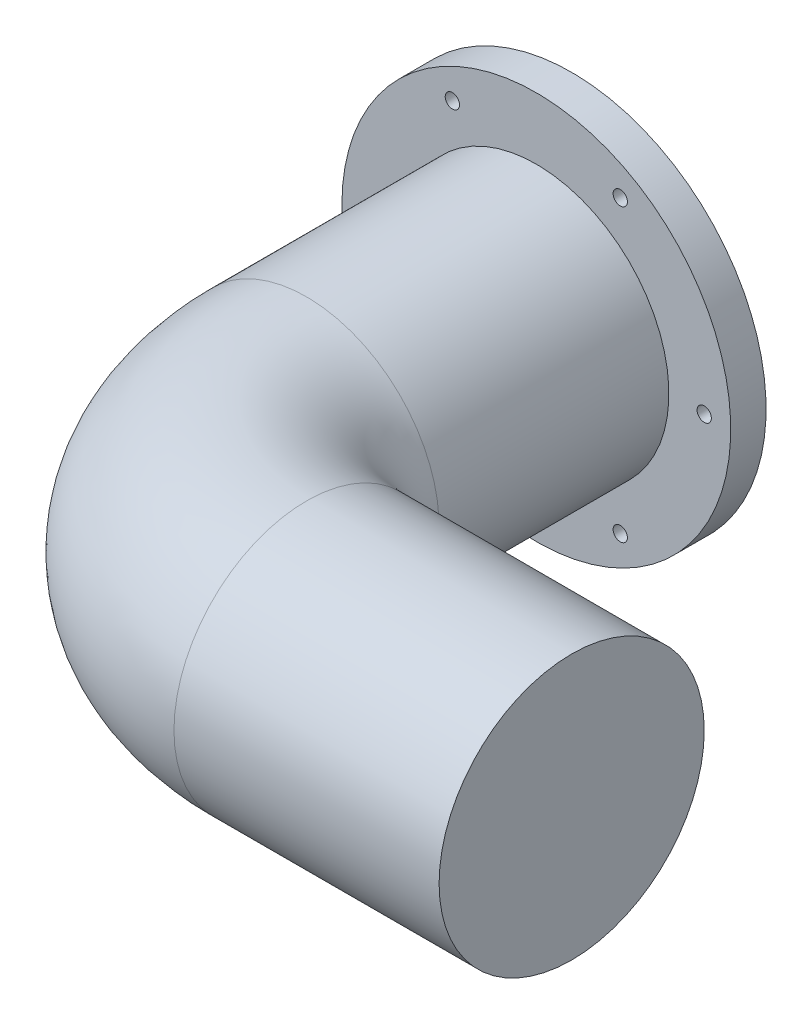
ISO-10303-21;
HEADER;
FILE_DESCRIPTION(('STEP AP214'),'2;1');
FILE_NAME('part.step','',(''),(''),'','','');
FILE_SCHEMA(('AUTOMOTIVE_DESIGN { 1 0 10303 214 1 1 1 1 }'));
ENDSEC;
DATA;
#1=APPLICATION_CONTEXT('core data for automotive mechanical design processes');
#2=APPLICATION_PROTOCOL_DEFINITION('international standard','automotive_design',2000,#1);
#3=PRODUCT_CONTEXT('',#1,'mechanical');
#4=PRODUCT('Part','Part','',(#3));
#5=PRODUCT_RELATED_PRODUCT_CATEGORY('part','',(#4));
#6=PRODUCT_DEFINITION_FORMATION('','',#4);
#7=PRODUCT_DEFINITION_CONTEXT('part definition',#1,'design');
#8=PRODUCT_DEFINITION('design','',#6,#7);
#9=PRODUCT_DEFINITION_SHAPE('','',#8);
#10=(LENGTH_UNIT() NAMED_UNIT(*) SI_UNIT(.MILLI.,.METRE.));
#11=(NAMED_UNIT(*) PLANE_ANGLE_UNIT() SI_UNIT($,.RADIAN.));
#12=(NAMED_UNIT(*) SI_UNIT($,.STERADIAN.) SOLID_ANGLE_UNIT());
#13=UNCERTAINTY_MEASURE_WITH_UNIT(LENGTH_MEASURE(1.E-05),#10,'distance_accuracy_value','');
#14=(GEOMETRIC_REPRESENTATION_CONTEXT(3) GLOBAL_UNCERTAINTY_ASSIGNED_CONTEXT((#13)) GLOBAL_UNIT_ASSIGNED_CONTEXT((#10,
#11,#12)) REPRESENTATION_CONTEXT('',''));
#15=CARTESIAN_POINT('',(0.,0.,0.));
#16=DIRECTION('',(0.,0.,1.));
#17=DIRECTION('',(1.,0.,0.));
#18=AXIS2_PLACEMENT_3D('',#15,#16,#17);
#19=CARTESIAN_POINT('',(-125.,0.,-115.));
#20=DIRECTION('',(0.,0.,-1.));
#21=DIRECTION('',(-1.,0.,0.));
#22=AXIS2_PLACEMENT_3D('',#19,#20,#21);
#23=PLANE('',#22);
#24=CARTESIAN_POINT('',(-148.75,-41.1362066797608,-115.));
#25=DIRECTION('',(0.,0.,1.));
#26=DIRECTION('',(1.,0.,0.));
#27=AXIS2_PLACEMENT_3D('',#24,#25,#26);
#28=CIRCLE('',#27,2.0193);
#29=CARTESIAN_POINT('',(-146.7307,-41.1362066797608,-115.));
#30=VERTEX_POINT('',#29);
#31=EDGE_CURVE('E115',#30,#30,#28,.T.);
#32=ORIENTED_EDGE('',*,*,#31,.F.);
#33=EDGE_LOOP('',(#32));
#34=FACE_BOUND('',#33,.T.);
#35=CARTESIAN_POINT('',(-101.25,-41.1362066797608,-115.));
#36=DIRECTION('',(0.,0.,1.));
#37=DIRECTION('',(1.,0.,0.));
#38=AXIS2_PLACEMENT_3D('',#35,#36,#37);
#39=CIRCLE('',#38,2.0193);
#40=CARTESIAN_POINT('',(-99.2307,-41.1362066797608,-115.));
#41=VERTEX_POINT('',#40);
#42=EDGE_CURVE('E107',#41,#41,#39,.T.);
#43=ORIENTED_EDGE('',*,*,#42,.F.);
#44=EDGE_LOOP('',(#43));
#45=FACE_BOUND('',#44,.T.);
#46=CARTESIAN_POINT('',(-101.25,41.1362066797608,-115.));
#47=DIRECTION('',(0.,0.,1.));
#48=DIRECTION('',(1.,0.,0.));
#49=AXIS2_PLACEMENT_3D('',#46,#47,#48);
#50=CIRCLE('',#49,2.0193);
#51=CARTESIAN_POINT('',(-99.2307,41.1362066797608,-115.));
#52=VERTEX_POINT('',#51);
#53=EDGE_CURVE('E91',#52,#52,#50,.T.);
#54=ORIENTED_EDGE('',*,*,#53,.F.);
#55=EDGE_LOOP('',(#54));
#56=FACE_BOUND('',#55,.T.);
#57=CARTESIAN_POINT('',(-125.,0.,-115.));
#58=DIRECTION('',(0.,0.,-1.));
#59=DIRECTION('',(-1.,0.,0.));
#60=AXIS2_PLACEMENT_3D('',#57,#58,#59);
#61=CIRCLE('',#60,37.5);
#62=CARTESIAN_POINT('',(-162.5,0.,-115.));
#63=VERTEX_POINT('',#62);
#64=EDGE_CURVE('E11',#63,#63,#61,.T.);
#65=ORIENTED_EDGE('',*,*,#64,.T.);
#66=EDGE_LOOP('',(#65));
#67=FACE_BOUND('',#66,.T.);
#68=CARTESIAN_POINT('',(-125.,0.,-115.));
#69=DIRECTION('',(0.,0.,-1.));
#70=DIRECTION('',(-1.,0.,0.));
#71=AXIS2_PLACEMENT_3D('',#68,#69,#70);
#72=CIRCLE('',#71,55.);
#73=CARTESIAN_POINT('',(-180.,0.,-115.));
#74=VERTEX_POINT('',#73);
#75=EDGE_CURVE('E79',#74,#74,#72,.T.);
#76=ORIENTED_EDGE('',*,*,#75,.F.);
#77=EDGE_LOOP('',(#76));
#78=FACE_BOUND('',#77,.T.);
#79=CARTESIAN_POINT('',(-77.5,0.,-115.));
#80=DIRECTION('',(0.,0.,1.));
#81=DIRECTION('',(1.,0.,0.));
#82=AXIS2_PLACEMENT_3D('',#79,#80,#81);
#83=CIRCLE('',#82,2.0193);
#84=CARTESIAN_POINT('',(-75.4807,0.,-115.));
#85=VERTEX_POINT('',#84);
#86=EDGE_CURVE('E99',#85,#85,#83,.T.);
#87=ORIENTED_EDGE('',*,*,#86,.F.);
#88=EDGE_LOOP('',(#87));
#89=FACE_BOUND('',#88,.T.);
#90=CARTESIAN_POINT('',(-172.5,0.,-115.));
#91=DIRECTION('',(0.,0.,1.));
#92=DIRECTION('',(1.,0.,0.));
#93=AXIS2_PLACEMENT_3D('',#90,#91,#92);
#94=CIRCLE('',#93,2.0193);
#95=CARTESIAN_POINT('',(-170.4807,0.,-115.));
#96=VERTEX_POINT('',#95);
#97=EDGE_CURVE('E123',#96,#96,#94,.T.);
#98=ORIENTED_EDGE('',*,*,#97,.F.);
#99=EDGE_LOOP('',(#98));
#100=FACE_BOUND('',#99,.T.);
#101=CARTESIAN_POINT('',(-148.75,41.1362066797608,-115.));
#102=DIRECTION('',(0.,0.,1.));
#103=DIRECTION('',(1.,0.,0.));
#104=AXIS2_PLACEMENT_3D('',#101,#102,#103);
#105=CIRCLE('',#104,2.0193);
#106=CARTESIAN_POINT('',(-146.7307,41.1362066797608,-115.));
#107=VERTEX_POINT('',#106);
#108=EDGE_CURVE('E131',#107,#107,#105,.T.);
#109=ORIENTED_EDGE('',*,*,#108,.F.);
#110=EDGE_LOOP('',(#109));
#111=FACE_BOUND('',#110,.T.);
#112=ADVANCED_FACE('F55',(#34,#45,#56,#67,#78,#89,#100,#111),#23,.F.);
#113=CARTESIAN_POINT('',(-125.,0.,-50.));
#114=DIRECTION('',(0.,0.,-1.));
#115=DIRECTION('',(-1.,0.,0.));
#116=AXIS2_PLACEMENT_3D('',#113,#114,#115);
#117=CYLINDRICAL_SURFACE('',#116,37.5);
#118=CARTESIAN_POINT('',(-125.,0.,-50.));
#119=DIRECTION('',(0.,0.,1.));
#120=DIRECTION('',(1.,0.,0.));
#121=AXIS2_PLACEMENT_3D('',#118,#119,#120);
#122=CIRCLE('',#121,37.5);
#123=CARTESIAN_POINT('',(-162.5,0.,-50.));
#124=VERTEX_POINT('',#123);
#125=EDGE_CURVE('E63',#124,#124,#122,.T.);
#126=ORIENTED_EDGE('',*,*,#125,.F.);
#127=EDGE_LOOP('',(#126));
#128=FACE_BOUND('',#127,.T.);
#129=ORIENTED_EDGE('',*,*,#64,.F.);
#130=EDGE_LOOP('',(#129));
#131=FACE_BOUND('',#130,.T.);
#132=ADVANCED_FACE('F217',(#128,#131),#117,.T.);
#133=CARTESIAN_POINT('',(0.,0.,0.));
#134=DIRECTION('',(1.,0.,0.));
#135=DIRECTION('',(0.,0.,-1.));
#136=AXIS2_PLACEMENT_3D('',#133,#134,#135);
#137=PLANE('',#136);
#138=CARTESIAN_POINT('',(0.,0.,0.));
#139=DIRECTION('',(1.,0.,0.));
#140=DIRECTION('',(0.,0.,-1.));
#141=AXIS2_PLACEMENT_3D('',#138,#139,#140);
#142=CIRCLE('',#141,37.5);
#143=CARTESIAN_POINT('',(0.,0.,-37.5));
#144=VERTEX_POINT('',#143);
#145=EDGE_CURVE('E73',#144,#144,#142,.T.);
#146=ORIENTED_EDGE('',*,*,#145,.T.);
#147=EDGE_LOOP('',(#146));
#148=FACE_BOUND('',#147,.T.);
#149=ADVANCED_FACE('F57',(#148),#137,.T.);
#150=CARTESIAN_POINT('',(0.,0.,0.));
#151=DIRECTION('',(-1.,0.,0.));
#152=DIRECTION('',(0.,0.,1.));
#153=AXIS2_PLACEMENT_3D('',#150,#151,#152);
#154=CYLINDRICAL_SURFACE('',#153,37.5);
#155=CARTESIAN_POINT('',(-75.,0.,0.));
#156=DIRECTION('',(1.,0.,0.));
#157=DIRECTION('',(0.,0.,-1.));
#158=AXIS2_PLACEMENT_3D('',#155,#156,#157);
#159=CIRCLE('',#158,37.5);
#160=CARTESIAN_POINT('',(-75.,0.,37.5));
#161=VERTEX_POINT('',#160);
#162=EDGE_CURVE('E68',#161,#161,#159,.T.);
#163=ORIENTED_EDGE('',*,*,#162,.T.);
#164=EDGE_LOOP('',(#163));
#165=FACE_BOUND('',#164,.T.);
#166=ORIENTED_EDGE('',*,*,#145,.F.);
#167=EDGE_LOOP('',(#166));
#168=FACE_BOUND('',#167,.T.);
#169=ADVANCED_FACE('F215',(#165,#168),#154,.T.);
#170=CARTESIAN_POINT('',(-75.,0.,-50.));
#171=DIRECTION('',(0.,-1.,0.));
#172=DIRECTION('',(0.,0.,-1.));
#173=AXIS2_PLACEMENT_3D('',#170,#171,#172);
#174=TOROIDAL_SURFACE('',#173,50.,37.5);
#175=CARTESIAN_POINT('',(-75.,0.,-50.));
#176=DIRECTION('',(0.,-1.,0.));
#177=DIRECTION('',(0.,0.,-1.));
#178=AXIS2_PLACEMENT_3D('',#175,#176,#177);
#179=CIRCLE('',#178,87.5);
#180=EDGE_CURVE('',#161,#124,#179,.T.);
#181=ORIENTED_EDGE('',*,*,#162,.F.);
#182=ORIENTED_EDGE('',*,*,#125,.T.);
#183=ORIENTED_EDGE('',*,*,#180,.T.);
#184=ORIENTED_EDGE('',*,*,#180,.F.);
#185=EDGE_LOOP('',(#181,#183,#182,#184));
#186=FACE_BOUND('',#185,.T.);
#187=ADVANCED_FACE('F209',(#186),#174,.T.);
#188=CARTESIAN_POINT('',(-125.,0.,-115.));
#189=DIRECTION('',(0.,0.,-1.));
#190=DIRECTION('',(-1.,0.,0.));
#191=AXIS2_PLACEMENT_3D('',#188,#189,#190);
#192=CYLINDRICAL_SURFACE('',#191,55.);
#193=ORIENTED_EDGE('',*,*,#75,.T.);
#194=EDGE_LOOP('',(#193));
#195=FACE_BOUND('',#194,.T.);
#196=CARTESIAN_POINT('',(-125.,0.,-125.));
#197=DIRECTION('',(0.,0.,-1.));
#198=DIRECTION('',(-1.,0.,0.));
#199=AXIS2_PLACEMENT_3D('',#196,#197,#198);
#200=CIRCLE('',#199,55.);
#201=CARTESIAN_POINT('',(-180.,0.,-125.));
#202=VERTEX_POINT('',#201);
#203=EDGE_CURVE('E80',#202,#202,#200,.T.);
#204=ORIENTED_EDGE('',*,*,#203,.F.);
#205=EDGE_LOOP('',(#204));
#206=FACE_BOUND('',#205,.T.);
#207=ADVANCED_FACE('F190',(#195,#206),#192,.T.);
#208=CARTESIAN_POINT('',(-125.,0.,-125.));
#209=DIRECTION('',(0.,0.,1.));
#210=DIRECTION('',(1.,0.,0.));
#211=AXIS2_PLACEMENT_3D('',#208,#209,#210);
#212=PLANE('',#211);
#213=CARTESIAN_POINT('',(-148.055532132327,-14.9897444306183,-125.));
#214=DIRECTION('',(0.,0.,-1.));
#215=DIRECTION('',(-1.,0.,0.));
#216=AXIS2_PLACEMENT_3D('',#213,#214,#215);
#217=CIRCLE('',#216,7.00000000000001);
#218=CARTESIAN_POINT('',(-155.055532132327,-14.9897444306183,-125.));
#219=VERTEX_POINT('',#218);
#220=EDGE_CURVE('E148',#219,#219,#217,.T.);
#221=ORIENTED_EDGE('',*,*,#220,.F.);
#222=EDGE_LOOP('',(#221));
#223=FACE_BOUND('',#222,.T.);
#224=CARTESIAN_POINT('',(-124.556438482612,-27.4964225524029,-125.));
#225=DIRECTION('',(0.,0.,-1.));
#226=DIRECTION('',(-1.,0.,0.));
#227=AXIS2_PLACEMENT_3D('',#224,#225,#226);
#228=CIRCLE('',#227,7.00000000000003);
#229=CARTESIAN_POINT('',(-131.556438482612,-27.4964225524029,-125.));
#230=VERTEX_POINT('',#229);
#231=EDGE_CURVE('E156',#230,#230,#228,.T.);
#232=ORIENTED_EDGE('',*,*,#231,.F.);
#233=EDGE_LOOP('',(#232));
#234=FACE_BOUND('',#233,.T.);
#235=CARTESIAN_POINT('',(-101.472972620166,-14.2382928284447,-125.));
#236=DIRECTION('',(0.,0.,-1.));
#237=DIRECTION('',(-1.,0.,0.));
#238=AXIS2_PLACEMENT_3D('',#235,#236,#237);
#239=CIRCLE('',#238,7.);
#240=CARTESIAN_POINT('',(-108.472972620166,-14.2382928284447,-125.));
#241=VERTEX_POINT('',#240);
#242=EDGE_CURVE('E164',#241,#241,#239,.T.);
#243=ORIENTED_EDGE('',*,*,#242,.F.);
#244=EDGE_LOOP('',(#243));
#245=FACE_BOUND('',#244,.T.);
#246=CARTESIAN_POINT('',(-100.434896061282,12.3614589947941,-125.));
#247=DIRECTION('',(0.,0.,-1.));
#248=DIRECTION('',(-1.,0.,0.));
#249=AXIS2_PLACEMENT_3D('',#246,#247,#248);
#250=CIRCLE('',#249,7.);
#251=CARTESIAN_POINT('',(-107.434896061282,12.3614589947941,-125.));
#252=VERTEX_POINT('',#251);
#253=EDGE_CURVE('E172',#252,#252,#250,.T.);
#254=ORIENTED_EDGE('',*,*,#253,.F.);
#255=EDGE_LOOP('',(#254));
#256=FACE_BOUND('',#255,.T.);
#257=CARTESIAN_POINT('',(-122.414911455471,27.3782270648949,-125.));
#258=DIRECTION('',(0.,0.,-1.));
#259=DIRECTION('',(-1.,0.,0.));
#260=AXIS2_PLACEMENT_3D('',#257,#258,#259);
#261=CIRCLE('',#260,7.00000000000004);
#262=CARTESIAN_POINT('',(-129.414911455471,27.3782270648949,-125.));
#263=VERTEX_POINT('',#262);
#264=EDGE_CURVE('E140',#263,#263,#261,.T.);
#265=ORIENTED_EDGE('',*,*,#264,.F.);
#266=EDGE_LOOP('',(#265));
#267=FACE_BOUND('',#266,.T.);
#268=CARTESIAN_POINT('',(-146.817216858009,16.7409392977397,-125.));
#269=DIRECTION('',(0.,0.,-1.));
#270=DIRECTION('',(-1.,0.,0.));
#271=AXIS2_PLACEMENT_3D('',#268,#269,#270);
#272=CIRCLE('',#271,7.00000000000001);
#273=CARTESIAN_POINT('',(-153.817216858009,16.7409392977397,-125.));
#274=VERTEX_POINT('',#273);
#275=EDGE_CURVE('E136',#274,#274,#272,.T.);
#276=ORIENTED_EDGE('',*,*,#275,.F.);
#277=EDGE_LOOP('',(#276));
#278=FACE_BOUND('',#277,.T.);
#279=CARTESIAN_POINT('',(-148.75,41.1362066797608,-125.));
#280=DIRECTION('',(0.,0.,1.));
#281=DIRECTION('',(1.,0.,0.));
#282=AXIS2_PLACEMENT_3D('',#279,#280,#281);
#283=CIRCLE('',#282,2.0193);
#284=CARTESIAN_POINT('',(-146.7307,41.1362066797608,-125.));
#285=VERTEX_POINT('',#284);
#286=EDGE_CURVE('E127',#285,#285,#283,.T.);
#287=ORIENTED_EDGE('',*,*,#286,.T.);
#288=EDGE_LOOP('',(#287));
#289=FACE_BOUND('',#288,.T.);
#290=CARTESIAN_POINT('',(-172.5,0.,-125.));
#291=DIRECTION('',(0.,0.,1.));
#292=DIRECTION('',(1.,0.,0.));
#293=AXIS2_PLACEMENT_3D('',#290,#291,#292);
#294=CIRCLE('',#293,2.0193);
#295=CARTESIAN_POINT('',(-170.4807,0.,-125.));
#296=VERTEX_POINT('',#295);
#297=EDGE_CURVE('E119',#296,#296,#294,.T.);
#298=ORIENTED_EDGE('',*,*,#297,.T.);
#299=EDGE_LOOP('',(#298));
#300=FACE_BOUND('',#299,.T.);
#301=CARTESIAN_POINT('',(-148.75,-41.1362066797608,-125.));
#302=DIRECTION('',(0.,0.,1.));
#303=DIRECTION('',(1.,0.,0.));
#304=AXIS2_PLACEMENT_3D('',#301,#302,#303);
#305=CIRCLE('',#304,2.0193);
#306=CARTESIAN_POINT('',(-146.7307,-41.1362066797608,-125.));
#307=VERTEX_POINT('',#306);
#308=EDGE_CURVE('E111',#307,#307,#305,.T.);
#309=ORIENTED_EDGE('',*,*,#308,.T.);
#310=EDGE_LOOP('',(#309));
#311=FACE_BOUND('',#310,.T.);
#312=CARTESIAN_POINT('',(-101.25,-41.1362066797608,-125.));
#313=DIRECTION('',(0.,0.,1.));
#314=DIRECTION('',(1.,0.,0.));
#315=AXIS2_PLACEMENT_3D('',#312,#313,#314);
#316=CIRCLE('',#315,2.0193);
#317=CARTESIAN_POINT('',(-99.2307,-41.1362066797608,-125.));
#318=VERTEX_POINT('',#317);
#319=EDGE_CURVE('E103',#318,#318,#316,.T.);
#320=ORIENTED_EDGE('',*,*,#319,.T.);
#321=EDGE_LOOP('',(#320));
#322=FACE_BOUND('',#321,.T.);
#323=CARTESIAN_POINT('',(-77.5,0.,-125.));
#324=DIRECTION('',(0.,0.,1.));
#325=DIRECTION('',(1.,0.,0.));
#326=AXIS2_PLACEMENT_3D('',#323,#324,#325);
#327=CIRCLE('',#326,2.0193);
#328=CARTESIAN_POINT('',(-75.4807,0.,-125.));
#329=VERTEX_POINT('',#328);
#330=EDGE_CURVE('E95',#329,#329,#327,.T.);
#331=ORIENTED_EDGE('',*,*,#330,.T.);
#332=EDGE_LOOP('',(#331));
#333=FACE_BOUND('',#332,.T.);
#334=CARTESIAN_POINT('',(-101.25,41.1362066797608,-125.));
#335=DIRECTION('',(0.,0.,1.));
#336=DIRECTION('',(1.,0.,0.));
#337=AXIS2_PLACEMENT_3D('',#334,#335,#336);
#338=CIRCLE('',#337,2.0193);
#339=CARTESIAN_POINT('',(-99.2307,41.1362066797608,-125.));
#340=VERTEX_POINT('',#339);
#341=EDGE_CURVE('E84',#340,#340,#338,.T.);
#342=ORIENTED_EDGE('',*,*,#341,.T.);
#343=EDGE_LOOP('',(#342));
#344=FACE_BOUND('',#343,.T.);
#345=ORIENTED_EDGE('',*,*,#203,.T.);
#346=EDGE_LOOP('',(#345));
#347=FACE_BOUND('',#346,.T.);
#348=ADVANCED_FACE('F186',(#223,#234,#245,#256,#267,#278,#289,#300,#311,#322,#333,#344,#347),
#212,.F.);
#349=CARTESIAN_POINT('',(-101.25,41.1362066797608,-115.));
#350=DIRECTION('',(0.,0.,1.));
#351=DIRECTION('',(1.,0.,0.));
#352=AXIS2_PLACEMENT_3D('',#349,#350,#351);
#353=CYLINDRICAL_SURFACE('',#352,2.0193);
#354=ORIENTED_EDGE('',*,*,#341,.F.);
#355=EDGE_LOOP('',(#354));
#356=FACE_BOUND('',#355,.T.);
#357=ORIENTED_EDGE('',*,*,#53,.T.);
#358=EDGE_LOOP('',(#357));
#359=FACE_BOUND('',#358,.T.);
#360=ADVANCED_FACE('F189',(#356,#359),#353,.F.);
#361=CARTESIAN_POINT('',(-77.5,0.,-115.));
#362=DIRECTION('',(0.,0.,1.));
#363=DIRECTION('',(1.,0.,0.));
#364=AXIS2_PLACEMENT_3D('',#361,#362,#363);
#365=CYLINDRICAL_SURFACE('',#364,2.0193);
#366=ORIENTED_EDGE('',*,*,#330,.F.);
#367=EDGE_LOOP('',(#366));
#368=FACE_BOUND('',#367,.T.);
#369=ORIENTED_EDGE('',*,*,#86,.T.);
#370=EDGE_LOOP('',(#369));
#371=FACE_BOUND('',#370,.T.);
#372=ADVANCED_FACE('F234',(#368,#371),#365,.F.);
#373=CARTESIAN_POINT('',(-101.25,-41.1362066797608,-115.));
#374=DIRECTION('',(0.,0.,1.));
#375=DIRECTION('',(1.,0.,0.));
#376=AXIS2_PLACEMENT_3D('',#373,#374,#375);
#377=CYLINDRICAL_SURFACE('',#376,2.0193);
#378=ORIENTED_EDGE('',*,*,#319,.F.);
#379=EDGE_LOOP('',(#378));
#380=FACE_BOUND('',#379,.T.);
#381=ORIENTED_EDGE('',*,*,#42,.T.);
#382=EDGE_LOOP('',(#381));
#383=FACE_BOUND('',#382,.T.);
#384=ADVANCED_FACE('F238',(#380,#383),#377,.F.);
#385=CARTESIAN_POINT('',(-148.75,-41.1362066797608,-115.));
#386=DIRECTION('',(0.,0.,1.));
#387=DIRECTION('',(1.,0.,0.));
#388=AXIS2_PLACEMENT_3D('',#385,#386,#387);
#389=CYLINDRICAL_SURFACE('',#388,2.0193);
#390=ORIENTED_EDGE('',*,*,#308,.F.);
#391=EDGE_LOOP('',(#390));
#392=FACE_BOUND('',#391,.T.);
#393=ORIENTED_EDGE('',*,*,#31,.T.);
#394=EDGE_LOOP('',(#393));
#395=FACE_BOUND('',#394,.T.);
#396=ADVANCED_FACE('F242',(#392,#395),#389,.F.);
#397=CARTESIAN_POINT('',(-172.5,0.,-115.));
#398=DIRECTION('',(0.,0.,1.));
#399=DIRECTION('',(1.,0.,0.));
#400=AXIS2_PLACEMENT_3D('',#397,#398,#399);
#401=CYLINDRICAL_SURFACE('',#400,2.0193);
#402=ORIENTED_EDGE('',*,*,#297,.F.);
#403=EDGE_LOOP('',(#402));
#404=FACE_BOUND('',#403,.T.);
#405=ORIENTED_EDGE('',*,*,#97,.T.);
#406=EDGE_LOOP('',(#405));
#407=FACE_BOUND('',#406,.T.);
#408=ADVANCED_FACE('F246',(#404,#407),#401,.F.);
#409=CARTESIAN_POINT('',(-148.75,41.1362066797608,-115.));
#410=DIRECTION('',(0.,0.,1.));
#411=DIRECTION('',(1.,0.,0.));
#412=AXIS2_PLACEMENT_3D('',#409,#410,#411);
#413=CYLINDRICAL_SURFACE('',#412,2.0193);
#414=ORIENTED_EDGE('',*,*,#286,.F.);
#415=EDGE_LOOP('',(#414));
#416=FACE_BOUND('',#415,.T.);
#417=ORIENTED_EDGE('',*,*,#108,.T.);
#418=EDGE_LOOP('',(#417));
#419=FACE_BOUND('',#418,.T.);
#420=ADVANCED_FACE('F250',(#416,#419),#413,.F.);
#421=CARTESIAN_POINT('',(-146.817216858009,16.7409392977397,-120.));
#422=DIRECTION('',(0.,0.,-1.));
#423=DIRECTION('',(-1.,0.,0.));
#424=AXIS2_PLACEMENT_3D('',#421,#422,#423);
#425=CYLINDRICAL_SURFACE('',#424,7.00000000000001);
#426=CARTESIAN_POINT('',(-146.817216858009,16.7409392977397,-120.));
#427=DIRECTION('',(0.,0.,-1.));
#428=DIRECTION('',(-1.,0.,0.));
#429=AXIS2_PLACEMENT_3D('',#426,#427,#428);
#430=CIRCLE('',#429,7.00000000000001);
#431=CARTESIAN_POINT('',(-153.817216858009,16.7409392977397,-120.));
#432=VERTEX_POINT('',#431);
#433=EDGE_CURVE('E135',#432,#432,#430,.T.);
#434=ORIENTED_EDGE('',*,*,#433,.F.);
#435=EDGE_LOOP('',(#434));
#436=FACE_BOUND('',#435,.T.);
#437=ORIENTED_EDGE('',*,*,#275,.T.);
#438=EDGE_LOOP('',(#437));
#439=FACE_BOUND('',#438,.T.);
#440=ADVANCED_FACE('F254',(#436,#439),#425,.F.);
#441=CARTESIAN_POINT('',(-146.817216858009,16.7409392977397,-120.));
#442=DIRECTION('',(0.,0.,-1.));
#443=DIRECTION('',(-1.,0.,0.));
#444=AXIS2_PLACEMENT_3D('',#441,#442,#443);
#445=PLANE('',#444);
#446=ORIENTED_EDGE('',*,*,#433,.T.);
#447=EDGE_LOOP('',(#446));
#448=FACE_BOUND('',#447,.T.);
#449=ADVANCED_FACE('F258',(#448),#445,.T.);
#450=CARTESIAN_POINT('',(-122.414911455471,27.3782270648949,-120.));
#451=DIRECTION('',(0.,0.,-1.));
#452=DIRECTION('',(-1.,0.,0.));
#453=AXIS2_PLACEMENT_3D('',#450,#451,#452);
#454=CYLINDRICAL_SURFACE('',#453,7.00000000000004);
#455=CARTESIAN_POINT('',(-122.414911455471,27.3782270648949,-120.));
#456=DIRECTION('',(0.,0.,-1.));
#457=DIRECTION('',(-1.,0.,0.));
#458=AXIS2_PLACEMENT_3D('',#455,#456,#457);
#459=CIRCLE('',#458,7.00000000000004);
#460=CARTESIAN_POINT('',(-129.414911455471,27.3782270648949,-120.));
#461=VERTEX_POINT('',#460);
#462=EDGE_CURVE('E176',#461,#461,#459,.T.);
#463=ORIENTED_EDGE('',*,*,#462,.F.);
#464=EDGE_LOOP('',(#463));
#465=FACE_BOUND('',#464,.T.);
#466=ORIENTED_EDGE('',*,*,#264,.T.);
#467=EDGE_LOOP('',(#466));
#468=FACE_BOUND('',#467,.T.);
#469=ADVANCED_FACE('F184',(#465,#468),#454,.F.);
#470=CARTESIAN_POINT('',(-122.414911455471,27.3782270648949,-120.));
#471=DIRECTION('',(0.,0.,-1.));
#472=DIRECTION('',(-1.,0.,0.));
#473=AXIS2_PLACEMENT_3D('',#470,#471,#472);
#474=PLANE('',#473);
#475=ORIENTED_EDGE('',*,*,#462,.T.);
#476=EDGE_LOOP('',(#475));
#477=FACE_BOUND('',#476,.T.);
#478=ADVANCED_FACE('F294',(#477),#474,.T.);
#479=CARTESIAN_POINT('',(-100.434896061282,12.3614589947941,-120.));
#480=DIRECTION('',(0.,0.,-1.));
#481=DIRECTION('',(-1.,0.,0.));
#482=AXIS2_PLACEMENT_3D('',#479,#480,#481);
#483=CYLINDRICAL_SURFACE('',#482,7.);
#484=CARTESIAN_POINT('',(-100.434896061282,12.3614589947941,-120.));
#485=DIRECTION('',(0.,0.,-1.));
#486=DIRECTION('',(-1.,0.,0.));
#487=AXIS2_PLACEMENT_3D('',#484,#485,#486);
#488=CIRCLE('',#487,7.);
#489=CARTESIAN_POINT('',(-107.434896061282,12.3614589947941,-120.));
#490=VERTEX_POINT('',#489);
#491=EDGE_CURVE('E168',#490,#490,#488,.T.);
#492=ORIENTED_EDGE('',*,*,#491,.F.);
#493=EDGE_LOOP('',(#492));
#494=FACE_BOUND('',#493,.T.);
#495=ORIENTED_EDGE('',*,*,#253,.T.);
#496=EDGE_LOOP('',(#495));
#497=FACE_BOUND('',#496,.T.);
#498=ADVANCED_FACE('F290',(#494,#497),#483,.F.);
#499=CARTESIAN_POINT('',(-100.434896061282,12.3614589947941,-120.));
#500=DIRECTION('',(0.,0.,-1.));
#501=DIRECTION('',(-1.,0.,0.));
#502=AXIS2_PLACEMENT_3D('',#499,#500,#501);
#503=PLANE('',#502);
#504=ORIENTED_EDGE('',*,*,#491,.T.);
#505=EDGE_LOOP('',(#504));
#506=FACE_BOUND('',#505,.T.);
#507=ADVANCED_FACE('F286',(#506),#503,.T.);
#508=CARTESIAN_POINT('',(-101.472972620166,-14.2382928284447,-120.));
#509=DIRECTION('',(0.,0.,-1.));
#510=DIRECTION('',(-1.,0.,0.));
#511=AXIS2_PLACEMENT_3D('',#508,#509,#510);
#512=CYLINDRICAL_SURFACE('',#511,7.);
#513=CARTESIAN_POINT('',(-101.472972620166,-14.2382928284447,-120.));
#514=DIRECTION('',(0.,0.,-1.));
#515=DIRECTION('',(-1.,0.,0.));
#516=AXIS2_PLACEMENT_3D('',#513,#514,#515);
#517=CIRCLE('',#516,7.);
#518=CARTESIAN_POINT('',(-108.472972620166,-14.2382928284447,-120.));
#519=VERTEX_POINT('',#518);
#520=EDGE_CURVE('E160',#519,#519,#517,.T.);
#521=ORIENTED_EDGE('',*,*,#520,.F.);
#522=EDGE_LOOP('',(#521));
#523=FACE_BOUND('',#522,.T.);
#524=ORIENTED_EDGE('',*,*,#242,.T.);
#525=EDGE_LOOP('',(#524));
#526=FACE_BOUND('',#525,.T.);
#527=ADVANCED_FACE('F282',(#523,#526),#512,.F.);
#528=CARTESIAN_POINT('',(-101.472972620166,-14.2382928284447,-120.));
#529=DIRECTION('',(0.,0.,-1.));
#530=DIRECTION('',(-1.,0.,0.));
#531=AXIS2_PLACEMENT_3D('',#528,#529,#530);
#532=PLANE('',#531);
#533=ORIENTED_EDGE('',*,*,#520,.T.);
#534=EDGE_LOOP('',(#533));
#535=FACE_BOUND('',#534,.T.);
#536=ADVANCED_FACE('F278',(#535),#532,.T.);
#537=CARTESIAN_POINT('',(-124.556438482612,-27.4964225524029,-120.));
#538=DIRECTION('',(0.,0.,-1.));
#539=DIRECTION('',(-1.,0.,0.));
#540=AXIS2_PLACEMENT_3D('',#537,#538,#539);
#541=CYLINDRICAL_SURFACE('',#540,7.00000000000003);
#542=CARTESIAN_POINT('',(-124.556438482612,-27.4964225524029,-120.));
#543=DIRECTION('',(0.,0.,-1.));
#544=DIRECTION('',(-1.,0.,0.));
#545=AXIS2_PLACEMENT_3D('',#542,#543,#544);
#546=CIRCLE('',#545,7.00000000000003);
#547=CARTESIAN_POINT('',(-131.556438482612,-27.4964225524029,-120.));
#548=VERTEX_POINT('',#547);
#549=EDGE_CURVE('E152',#548,#548,#546,.T.);
#550=ORIENTED_EDGE('',*,*,#549,.F.);
#551=EDGE_LOOP('',(#550));
#552=FACE_BOUND('',#551,.T.);
#553=ORIENTED_EDGE('',*,*,#231,.T.);
#554=EDGE_LOOP('',(#553));
#555=FACE_BOUND('',#554,.T.);
#556=ADVANCED_FACE('F274',(#552,#555),#541,.F.);
#557=CARTESIAN_POINT('',(-124.556438482612,-27.4964225524029,-120.));
#558=DIRECTION('',(0.,0.,-1.));
#559=DIRECTION('',(-1.,0.,0.));
#560=AXIS2_PLACEMENT_3D('',#557,#558,#559);
#561=PLANE('',#560);
#562=ORIENTED_EDGE('',*,*,#549,.T.);
#563=EDGE_LOOP('',(#562));
#564=FACE_BOUND('',#563,.T.);
#565=ADVANCED_FACE('F270',(#564),#561,.T.);
#566=CARTESIAN_POINT('',(-148.055532132327,-14.9897444306183,-120.));
#567=DIRECTION('',(0.,0.,-1.));
#568=DIRECTION('',(-1.,0.,0.));
#569=AXIS2_PLACEMENT_3D('',#566,#567,#568);
#570=CYLINDRICAL_SURFACE('',#569,7.00000000000001);
#571=CARTESIAN_POINT('',(-148.055532132327,-14.9897444306183,-120.));
#572=DIRECTION('',(0.,0.,-1.));
#573=DIRECTION('',(-1.,0.,0.));
#574=AXIS2_PLACEMENT_3D('',#571,#572,#573);
#575=CIRCLE('',#574,7.00000000000001);
#576=CARTESIAN_POINT('',(-155.055532132327,-14.9897444306183,-120.));
#577=VERTEX_POINT('',#576);
#578=EDGE_CURVE('E144',#577,#577,#575,.T.);
#579=ORIENTED_EDGE('',*,*,#578,.F.);
#580=EDGE_LOOP('',(#579));
#581=FACE_BOUND('',#580,.T.);
#582=ORIENTED_EDGE('',*,*,#220,.T.);
#583=EDGE_LOOP('',(#582));
#584=FACE_BOUND('',#583,.T.);
#585=ADVANCED_FACE('F266',(#581,#584),#570,.F.);
#586=CARTESIAN_POINT('',(-148.055532132327,-14.9897444306183,-120.));
#587=DIRECTION('',(0.,0.,-1.));
#588=DIRECTION('',(-1.,0.,0.));
#589=AXIS2_PLACEMENT_3D('',#586,#587,#588);
#590=PLANE('',#589);
#591=ORIENTED_EDGE('',*,*,#578,.T.);
#592=EDGE_LOOP('',(#591));
#593=FACE_BOUND('',#592,.T.);
#594=ADVANCED_FACE('F263',(#593),#590,.T.);
#595=CLOSED_SHELL('',(#112,#132,#149,#169,#187,#207,#348,#360,#372,#384,#396,#408,#420,#440,
#449,#469,#478,#498,#507,#527,#536,#556,#565,#585,#594));
#596=MANIFOLD_SOLID_BREP('B2',#595);
#597=ADVANCED_BREP_SHAPE_REPRESENTATION('',(#18,#596),#14);
#598=SHAPE_DEFINITION_REPRESENTATION(#9,#597);
ENDSEC;
END-ISO-10303-21;
